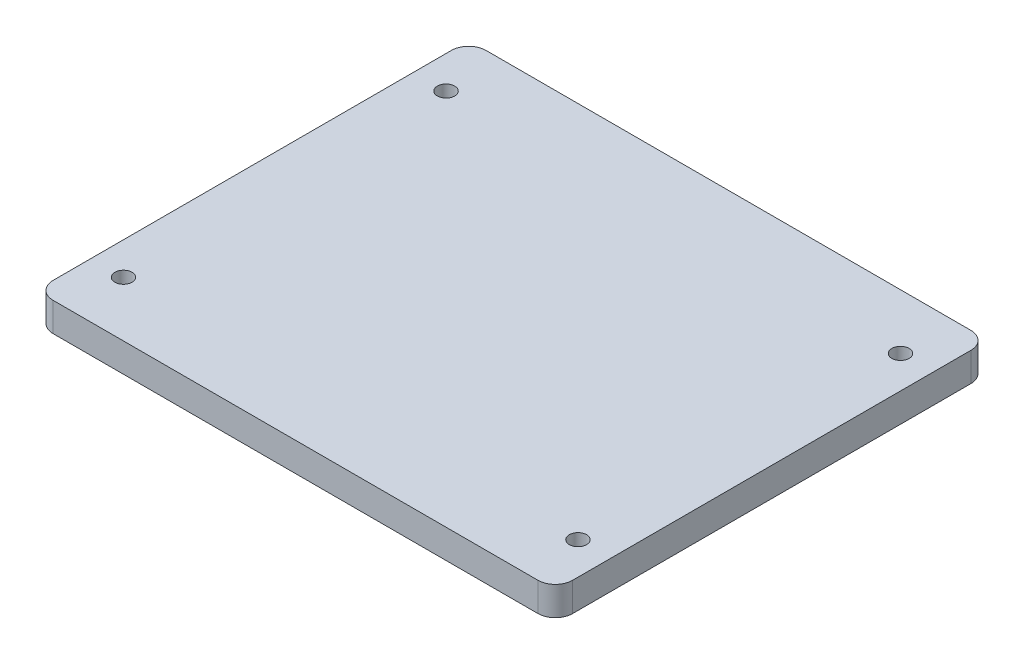
ISO-10303-21;
HEADER;
FILE_DESCRIPTION(('STEP AP214'),'2;1');
FILE_NAME('part.step','',(''),(''),'','','');
FILE_SCHEMA(('AUTOMOTIVE_DESIGN { 1 0 10303 214 1 1 1 1 }'));
ENDSEC;
DATA;
#1=APPLICATION_CONTEXT('core data for automotive mechanical design processes');
#2=APPLICATION_PROTOCOL_DEFINITION('international standard','automotive_design',2000,#1);
#3=PRODUCT_CONTEXT('',#1,'mechanical');
#4=PRODUCT('Part','Part','',(#3));
#5=PRODUCT_RELATED_PRODUCT_CATEGORY('part','',(#4));
#6=PRODUCT_DEFINITION_FORMATION('','',#4);
#7=PRODUCT_DEFINITION_CONTEXT('part definition',#1,'design');
#8=PRODUCT_DEFINITION('design','',#6,#7);
#9=PRODUCT_DEFINITION_SHAPE('','',#8);
#10=(LENGTH_UNIT() NAMED_UNIT(*) SI_UNIT(.MILLI.,.METRE.));
#11=(NAMED_UNIT(*) PLANE_ANGLE_UNIT() SI_UNIT($,.RADIAN.));
#12=(NAMED_UNIT(*) SI_UNIT($,.STERADIAN.) SOLID_ANGLE_UNIT());
#13=UNCERTAINTY_MEASURE_WITH_UNIT(LENGTH_MEASURE(1.E-05),#10,'distance_accuracy_value','');
#14=(GEOMETRIC_REPRESENTATION_CONTEXT(3) GLOBAL_UNCERTAINTY_ASSIGNED_CONTEXT((#13)) GLOBAL_UNIT_ASSIGNED_CONTEXT((#10,
#11,#12)) REPRESENTATION_CONTEXT('',''));
#15=CARTESIAN_POINT('',(0.,0.,0.));
#16=DIRECTION('',(0.,0.,1.));
#17=DIRECTION('',(1.,0.,0.));
#18=AXIS2_PLACEMENT_3D('',#15,#16,#17);
#19=CARTESIAN_POINT('',(0.,0.,0.));
#20=DIRECTION('',(0.,1.,0.));
#21=DIRECTION('',(0.,0.,1.));
#22=AXIS2_PLACEMENT_3D('',#19,#20,#21);
#23=PLANE('',#22);
#24=CARTESIAN_POINT('',(22.5,0.,32.5));
#25=DIRECTION('',(0.,-1.,0.));
#26=DIRECTION('',(0.,0.,-1.));
#27=AXIS2_PLACEMENT_3D('',#24,#25,#26);
#28=CIRCLE('',#27,4.50000000000001);
#29=CARTESIAN_POINT('',(22.5,0.,28.));
#30=VERTEX_POINT('',#29);
#31=EDGE_CURVE('E221',#30,#30,#28,.T.);
#32=ORIENTED_EDGE('',*,*,#31,.F.);
#33=EDGE_LOOP('',(#32));
#34=FACE_BOUND('',#33,.T.);
#35=CARTESIAN_POINT('',(-22.5,0.,32.5));
#36=DIRECTION('',(0.,-1.,0.));
#37=DIRECTION('',(0.,0.,-1.));
#38=AXIS2_PLACEMENT_3D('',#35,#36,#37);
#39=CIRCLE('',#38,4.50000000000001);
#40=CARTESIAN_POINT('',(-22.5,0.,28.));
#41=VERTEX_POINT('',#40);
#42=EDGE_CURVE('E227',#41,#41,#39,.F.);
#43=ORIENTED_EDGE('',*,*,#42,.T.);
#44=EDGE_LOOP('',(#43));
#45=FACE_BOUND('',#44,.T.);
#46=CARTESIAN_POINT('',(-22.5,0.,-32.5));
#47=DIRECTION('',(0.,-1.,0.));
#48=DIRECTION('',(0.,0.,-1.));
#49=AXIS2_PLACEMENT_3D('',#46,#47,#48);
#50=CIRCLE('',#49,4.5);
#51=CARTESIAN_POINT('',(-22.5,0.,-37.));
#52=VERTEX_POINT('',#51);
#53=EDGE_CURVE('E209',#52,#52,#50,.F.);
#54=ORIENTED_EDGE('',*,*,#53,.T.);
#55=EDGE_LOOP('',(#54));
#56=FACE_BOUND('',#55,.T.);
#57=CARTESIAN_POINT('',(-39.37,0.,27.94));
#58=DIRECTION('',(0.,1.,0.));
#59=DIRECTION('',(0.,0.,1.));
#60=AXIS2_PLACEMENT_3D('',#57,#58,#59);
#61=CIRCLE('',#60,1.5);
#62=CARTESIAN_POINT('',(-39.37,0.,29.44));
#63=VERTEX_POINT('',#62);
#64=EDGE_CURVE('E194',#63,#63,#61,.F.);
#65=ORIENTED_EDGE('',*,*,#64,.F.);
#66=EDGE_LOOP('',(#65));
#67=FACE_BOUND('',#66,.T.);
#68=CARTESIAN_POINT('',(39.37,0.,27.94));
#69=DIRECTION('',(0.,1.,0.));
#70=DIRECTION('',(0.,0.,1.));
#71=AXIS2_PLACEMENT_3D('',#68,#69,#70);
#72=CIRCLE('',#71,1.5);
#73=CARTESIAN_POINT('',(39.37,0.,29.44));
#74=VERTEX_POINT('',#73);
#75=EDGE_CURVE('E202',#74,#74,#72,.F.);
#76=ORIENTED_EDGE('',*,*,#75,.F.);
#77=EDGE_LOOP('',(#76));
#78=FACE_BOUND('',#77,.T.);
#79=CARTESIAN_POINT('',(39.37,0.,-27.94));
#80=DIRECTION('',(0.,1.,0.));
#81=DIRECTION('',(0.,0.,1.));
#82=AXIS2_PLACEMENT_3D('',#79,#80,#81);
#83=CIRCLE('',#82,1.5);
#84=CARTESIAN_POINT('',(39.37,0.,-26.44));
#85=VERTEX_POINT('',#84);
#86=EDGE_CURVE('E187',#85,#85,#83,.F.);
#87=ORIENTED_EDGE('',*,*,#86,.F.);
#88=EDGE_LOOP('',(#87));
#89=FACE_BOUND('',#88,.T.);
#90=CARTESIAN_POINT('',(-39.37,0.,-27.94));
#91=DIRECTION('',(0.,1.,0.));
#92=DIRECTION('',(0.,0.,1.));
#93=AXIS2_PLACEMENT_3D('',#90,#91,#92);
#94=CIRCLE('',#93,1.5);
#95=CARTESIAN_POINT('',(-39.37,0.,-26.44));
#96=VERTEX_POINT('',#95);
#97=EDGE_CURVE('E178',#96,#96,#94,.F.);
#98=ORIENTED_EDGE('',*,*,#97,.F.);
#99=EDGE_LOOP('',(#98));
#100=FACE_BOUND('',#99,.T.);
#101=DIRECTION('',(0.,0.,1.));
#102=VECTOR('',#101,1.);
#103=CARTESIAN_POINT('',(-45.,0.,-37.5));
#104=LINE('',#103,#102);
#105=CARTESIAN_POINT('',(-45.,0.,-34.5));
#106=VERTEX_POINT('',#105);
#107=CARTESIAN_POINT('',(-45.,0.,34.5));
#108=VERTEX_POINT('',#107);
#109=EDGE_CURVE('E120',#106,#108,#104,.T.);
#110=ORIENTED_EDGE('',*,*,#109,.F.);
#111=CARTESIAN_POINT('',(-42.,0.,-34.5));
#112=DIRECTION('',(0.,1.,0.));
#113=DIRECTION('',(0.,0.,1.));
#114=AXIS2_PLACEMENT_3D('',#111,#112,#113);
#115=CIRCLE('',#114,3.);
#116=CARTESIAN_POINT('',(-42.,0.,-37.5));
#117=VERTEX_POINT('',#116);
#118=EDGE_CURVE('E103',#106,#117,#115,.F.);
#119=ORIENTED_EDGE('',*,*,#118,.T.);
#120=DIRECTION('',(-1.,0.,0.));
#121=VECTOR('',#120,1.);
#122=CARTESIAN_POINT('',(-45.,0.,-37.5));
#123=LINE('',#122,#121);
#124=CARTESIAN_POINT('',(42.,0.,-37.5));
#125=VERTEX_POINT('',#124);
#126=EDGE_CURVE('E129',#125,#117,#123,.T.);
#127=ORIENTED_EDGE('',*,*,#126,.F.);
#128=CARTESIAN_POINT('',(42.,0.,-34.5));
#129=DIRECTION('',(0.,1.,0.));
#130=DIRECTION('',(0.,0.,1.));
#131=AXIS2_PLACEMENT_3D('',#128,#129,#130);
#132=CIRCLE('',#131,3.);
#133=CARTESIAN_POINT('',(45.,0.,-34.5));
#134=VERTEX_POINT('',#133);
#135=EDGE_CURVE('E114',#125,#134,#132,.F.);
#136=ORIENTED_EDGE('',*,*,#135,.T.);
#137=DIRECTION('',(0.,0.,-1.));
#138=VECTOR('',#137,1.);
#139=CARTESIAN_POINT('',(45.,0.,-37.5));
#140=LINE('',#139,#138);
#141=CARTESIAN_POINT('',(45.,0.,34.5));
#142=VERTEX_POINT('',#141);
#143=EDGE_CURVE('E133',#142,#134,#140,.T.);
#144=ORIENTED_EDGE('',*,*,#143,.F.);
#145=CARTESIAN_POINT('',(42.,0.,34.5));
#146=DIRECTION('',(0.,1.,0.));
#147=DIRECTION('',(0.,0.,1.));
#148=AXIS2_PLACEMENT_3D('',#145,#146,#147);
#149=CIRCLE('',#148,3.);
#150=CARTESIAN_POINT('',(42.,0.,37.5));
#151=VERTEX_POINT('',#150);
#152=EDGE_CURVE('E140',#142,#151,#149,.F.);
#153=ORIENTED_EDGE('',*,*,#152,.T.);
#154=DIRECTION('',(1.,0.,0.));
#155=VECTOR('',#154,1.);
#156=CARTESIAN_POINT('',(-45.,0.,37.5));
#157=LINE('',#156,#155);
#158=CARTESIAN_POINT('',(-42.,0.,37.5));
#159=VERTEX_POINT('',#158);
#160=EDGE_CURVE('E128',#159,#151,#157,.T.);
#161=ORIENTED_EDGE('',*,*,#160,.F.);
#162=CARTESIAN_POINT('',(-42.,0.,34.5));
#163=DIRECTION('',(0.,1.,0.));
#164=DIRECTION('',(0.,0.,1.));
#165=AXIS2_PLACEMENT_3D('',#162,#163,#164);
#166=CIRCLE('',#165,3.);
#167=EDGE_CURVE('E123',#159,#108,#166,.F.);
#168=ORIENTED_EDGE('',*,*,#167,.T.);
#169=EDGE_LOOP('',(#110,#119,#127,#136,#144,#153,#161,#168));
#170=FACE_BOUND('',#169,.T.);
#171=CARTESIAN_POINT('',(22.5,0.,-32.5));
#172=DIRECTION('',(0.,-1.,0.));
#173=DIRECTION('',(0.,0.,-1.));
#174=AXIS2_PLACEMENT_3D('',#171,#172,#173);
#175=CIRCLE('',#174,4.5);
#176=CARTESIAN_POINT('',(22.5,0.,-37.));
#177=VERTEX_POINT('',#176);
#178=EDGE_CURVE('E215',#177,#177,#175,.T.);
#179=ORIENTED_EDGE('',*,*,#178,.F.);
#180=EDGE_LOOP('',(#179));
#181=FACE_BOUND('',#180,.T.);
#182=ADVANCED_FACE('F38',(#34,#45,#56,#67,#78,#89,#100,#170,#181),#23,.F.);
#183=CARTESIAN_POINT('',(45.,5.,-37.5));
#184=DIRECTION('',(-1.,0.,0.));
#185=DIRECTION('',(0.,0.,1.));
#186=AXIS2_PLACEMENT_3D('',#183,#184,#185);
#187=PLANE('',#186);
#188=ORIENTED_EDGE('',*,*,#143,.T.);
#189=DIRECTION('',(0.,-1.,0.));
#190=VECTOR('',#189,1.);
#191=CARTESIAN_POINT('',(45.,5.,-34.5));
#192=LINE('',#191,#190);
#193=CARTESIAN_POINT('',(45.,5.,-34.5));
#194=VERTEX_POINT('',#193);
#195=EDGE_CURVE('E156',#134,#194,#192,.F.);
#196=ORIENTED_EDGE('',*,*,#195,.T.);
#197=DIRECTION('',(0.,0.,-1.));
#198=VECTOR('',#197,1.);
#199=CARTESIAN_POINT('',(45.,5.,-37.5));
#200=LINE('',#199,#198);
#201=CARTESIAN_POINT('',(45.,5.,34.5));
#202=VERTEX_POINT('',#201);
#203=EDGE_CURVE('E131',#202,#194,#200,.T.);
#204=ORIENTED_EDGE('',*,*,#203,.F.);
#205=DIRECTION('',(0.,-1.,0.));
#206=VECTOR('',#205,1.);
#207=CARTESIAN_POINT('',(45.,5.,34.5));
#208=LINE('',#207,#206);
#209=EDGE_CURVE('E153',#202,#142,#208,.T.);
#210=ORIENTED_EDGE('',*,*,#209,.T.);
#211=EDGE_LOOP('',(#188,#196,#204,#210));
#212=FACE_BOUND('',#211,.T.);
#213=ADVANCED_FACE('F169',(#212),#187,.F.);
#214=CARTESIAN_POINT('',(-45.,5.,-37.5));
#215=DIRECTION('',(0.,0.,1.));
#216=DIRECTION('',(1.,0.,0.));
#217=AXIS2_PLACEMENT_3D('',#214,#215,#216);
#218=PLANE('',#217);
#219=ORIENTED_EDGE('',*,*,#126,.T.);
#220=DIRECTION('',(0.,-1.,0.));
#221=VECTOR('',#220,1.);
#222=CARTESIAN_POINT('',(-42.,5.,-37.5));
#223=LINE('',#222,#221);
#224=CARTESIAN_POINT('',(-42.,5.,-37.5));
#225=VERTEX_POINT('',#224);
#226=EDGE_CURVE('E108',#117,#225,#223,.F.);
#227=ORIENTED_EDGE('',*,*,#226,.T.);
#228=DIRECTION('',(-1.,0.,0.));
#229=VECTOR('',#228,1.);
#230=CARTESIAN_POINT('',(-45.,5.,-37.5));
#231=LINE('',#230,#229);
#232=CARTESIAN_POINT('',(42.,5.,-37.5));
#233=VERTEX_POINT('',#232);
#234=EDGE_CURVE('E173',#233,#225,#231,.T.);
#235=ORIENTED_EDGE('',*,*,#234,.F.);
#236=DIRECTION('',(0.,-1.,0.));
#237=VECTOR('',#236,1.);
#238=CARTESIAN_POINT('',(42.,5.,-37.5));
#239=LINE('',#238,#237);
#240=EDGE_CURVE('E113',#233,#125,#239,.T.);
#241=ORIENTED_EDGE('',*,*,#240,.T.);
#242=EDGE_LOOP('',(#219,#227,#235,#241));
#243=FACE_BOUND('',#242,.T.);
#244=ADVANCED_FACE('F255',(#243),#218,.F.);
#245=CARTESIAN_POINT('',(-45.,5.,-37.5));
#246=DIRECTION('',(1.,0.,0.));
#247=DIRECTION('',(0.,0.,-1.));
#248=AXIS2_PLACEMENT_3D('',#245,#246,#247);
#249=PLANE('',#248);
#250=DIRECTION('',(0.,0.,1.));
#251=VECTOR('',#250,1.);
#252=CARTESIAN_POINT('',(-45.,5.,-37.5));
#253=LINE('',#252,#251);
#254=CARTESIAN_POINT('',(-45.,5.,-34.5));
#255=VERTEX_POINT('',#254);
#256=CARTESIAN_POINT('',(-45.,5.,34.5));
#257=VERTEX_POINT('',#256);
#258=EDGE_CURVE('E122',#255,#257,#253,.T.);
#259=ORIENTED_EDGE('',*,*,#258,.F.);
#260=DIRECTION('',(0.,-1.,0.));
#261=VECTOR('',#260,1.);
#262=CARTESIAN_POINT('',(-45.,5.,-34.5));
#263=LINE('',#262,#261);
#264=EDGE_CURVE('E107',#255,#106,#263,.T.);
#265=ORIENTED_EDGE('',*,*,#264,.T.);
#266=ORIENTED_EDGE('',*,*,#109,.T.);
#267=DIRECTION('',(0.,-1.,0.));
#268=VECTOR('',#267,1.);
#269=CARTESIAN_POINT('',(-45.,5.,34.5));
#270=LINE('',#269,#268);
#271=EDGE_CURVE('E124',#108,#257,#270,.F.);
#272=ORIENTED_EDGE('',*,*,#271,.T.);
#273=EDGE_LOOP('',(#259,#265,#266,#272));
#274=FACE_BOUND('',#273,.T.);
#275=ADVANCED_FACE('F119',(#274),#249,.F.);
#276=CARTESIAN_POINT('',(-45.,5.,37.5));
#277=DIRECTION('',(0.,0.,-1.));
#278=DIRECTION('',(-1.,0.,0.));
#279=AXIS2_PLACEMENT_3D('',#276,#277,#278);
#280=PLANE('',#279);
#281=ORIENTED_EDGE('',*,*,#160,.T.);
#282=DIRECTION('',(0.,-1.,0.));
#283=VECTOR('',#282,1.);
#284=CARTESIAN_POINT('',(42.,5.,37.5));
#285=LINE('',#284,#283);
#286=CARTESIAN_POINT('',(42.,5.,37.5));
#287=VERTEX_POINT('',#286);
#288=EDGE_CURVE('E11',#151,#287,#285,.F.);
#289=ORIENTED_EDGE('',*,*,#288,.T.);
#290=DIRECTION('',(1.,0.,0.));
#291=VECTOR('',#290,1.);
#292=CARTESIAN_POINT('',(-45.,5.,37.5));
#293=LINE('',#292,#291);
#294=CARTESIAN_POINT('',(-42.,5.,37.5));
#295=VERTEX_POINT('',#294);
#296=EDGE_CURVE('E137',#295,#287,#293,.T.);
#297=ORIENTED_EDGE('',*,*,#296,.F.);
#298=DIRECTION('',(0.,-1.,0.));
#299=VECTOR('',#298,1.);
#300=CARTESIAN_POINT('',(-42.,5.,37.5));
#301=LINE('',#300,#299);
#302=EDGE_CURVE('E46',#295,#159,#301,.T.);
#303=ORIENTED_EDGE('',*,*,#302,.T.);
#304=EDGE_LOOP('',(#281,#289,#297,#303));
#305=FACE_BOUND('',#304,.T.);
#306=ADVANCED_FACE('F159',(#305),#280,.F.);
#307=CARTESIAN_POINT('',(0.,5.,0.));
#308=DIRECTION('',(0.,1.,0.));
#309=DIRECTION('',(0.,0.,1.));
#310=AXIS2_PLACEMENT_3D('',#307,#308,#309);
#311=PLANE('',#310);
#312=CARTESIAN_POINT('',(-39.37,5.,27.94));
#313=DIRECTION('',(0.,1.,0.));
#314=DIRECTION('',(0.,0.,1.));
#315=AXIS2_PLACEMENT_3D('',#312,#313,#314);
#316=CIRCLE('',#315,1.5);
#317=CARTESIAN_POINT('',(-39.37,5.,29.44));
#318=VERTEX_POINT('',#317);
#319=EDGE_CURVE('E198',#318,#318,#316,.T.);
#320=ORIENTED_EDGE('',*,*,#319,.F.);
#321=EDGE_LOOP('',(#320));
#322=FACE_BOUND('',#321,.T.);
#323=CARTESIAN_POINT('',(39.37,5.,27.94));
#324=DIRECTION('',(0.,1.,0.));
#325=DIRECTION('',(0.,0.,1.));
#326=AXIS2_PLACEMENT_3D('',#323,#324,#325);
#327=CIRCLE('',#326,1.5);
#328=CARTESIAN_POINT('',(39.37,5.,29.44));
#329=VERTEX_POINT('',#328);
#330=EDGE_CURVE('E197',#329,#329,#327,.T.);
#331=ORIENTED_EDGE('',*,*,#330,.F.);
#332=EDGE_LOOP('',(#331));
#333=FACE_BOUND('',#332,.T.);
#334=CARTESIAN_POINT('',(39.37,5.,-27.94));
#335=DIRECTION('',(0.,1.,0.));
#336=DIRECTION('',(0.,0.,1.));
#337=AXIS2_PLACEMENT_3D('',#334,#335,#336);
#338=CIRCLE('',#337,1.5);
#339=CARTESIAN_POINT('',(39.37,5.,-26.44));
#340=VERTEX_POINT('',#339);
#341=EDGE_CURVE('E191',#340,#340,#338,.T.);
#342=ORIENTED_EDGE('',*,*,#341,.F.);
#343=EDGE_LOOP('',(#342));
#344=FACE_BOUND('',#343,.T.);
#345=CARTESIAN_POINT('',(-39.37,5.,-27.94));
#346=DIRECTION('',(0.,1.,0.));
#347=DIRECTION('',(0.,0.,1.));
#348=AXIS2_PLACEMENT_3D('',#345,#346,#347);
#349=CIRCLE('',#348,1.5);
#350=CARTESIAN_POINT('',(-39.37,5.,-26.44));
#351=VERTEX_POINT('',#350);
#352=EDGE_CURVE('E183',#351,#351,#349,.T.);
#353=ORIENTED_EDGE('',*,*,#352,.F.);
#354=EDGE_LOOP('',(#353));
#355=FACE_BOUND('',#354,.T.);
#356=ORIENTED_EDGE('',*,*,#234,.T.);
#357=CARTESIAN_POINT('',(-42.,5.,-34.5));
#358=DIRECTION('',(0.,1.,0.));
#359=DIRECTION('',(0.,0.,1.));
#360=AXIS2_PLACEMENT_3D('',#357,#358,#359);
#361=CIRCLE('',#360,3.);
#362=EDGE_CURVE('E151',#225,#255,#361,.T.);
#363=ORIENTED_EDGE('',*,*,#362,.T.);
#364=ORIENTED_EDGE('',*,*,#258,.T.);
#365=CARTESIAN_POINT('',(-42.,5.,34.5));
#366=DIRECTION('',(0.,1.,0.));
#367=DIRECTION('',(0.,0.,1.));
#368=AXIS2_PLACEMENT_3D('',#365,#366,#367);
#369=CIRCLE('',#368,3.);
#370=EDGE_CURVE('E58',#257,#295,#369,.T.);
#371=ORIENTED_EDGE('',*,*,#370,.T.);
#372=ORIENTED_EDGE('',*,*,#296,.T.);
#373=CARTESIAN_POINT('',(42.,5.,34.5));
#374=DIRECTION('',(0.,1.,0.));
#375=DIRECTION('',(0.,0.,1.));
#376=AXIS2_PLACEMENT_3D('',#373,#374,#375);
#377=CIRCLE('',#376,3.);
#378=EDGE_CURVE('E147',#287,#202,#377,.T.);
#379=ORIENTED_EDGE('',*,*,#378,.T.);
#380=ORIENTED_EDGE('',*,*,#203,.T.);
#381=CARTESIAN_POINT('',(42.,5.,-34.5));
#382=DIRECTION('',(0.,1.,0.));
#383=DIRECTION('',(0.,0.,1.));
#384=AXIS2_PLACEMENT_3D('',#381,#382,#383);
#385=CIRCLE('',#384,3.);
#386=EDGE_CURVE('E149',#194,#233,#385,.T.);
#387=ORIENTED_EDGE('',*,*,#386,.T.);
#388=EDGE_LOOP('',(#356,#363,#364,#371,#372,#379,#380,#387));
#389=FACE_BOUND('',#388,.T.);
#390=ADVANCED_FACE('F261',(#322,#333,#344,#355,#389),#311,.T.);
#391=CARTESIAN_POINT('',(-39.37,-4.24264068711929,-27.94));
#392=DIRECTION('',(0.,1.,0.));
#393=DIRECTION('',(0.,0.,1.));
#394=AXIS2_PLACEMENT_3D('',#391,#392,#393);
#395=CYLINDRICAL_SURFACE('',#394,1.5);
#396=ORIENTED_EDGE('',*,*,#97,.T.);
#397=EDGE_LOOP('',(#396));
#398=FACE_BOUND('',#397,.T.);
#399=ORIENTED_EDGE('',*,*,#352,.T.);
#400=EDGE_LOOP('',(#399));
#401=FACE_BOUND('',#400,.T.);
#402=ADVANCED_FACE('F285',(#398,#401),#395,.F.);
#403=CARTESIAN_POINT('',(39.37,-4.24264068711929,-27.94));
#404=DIRECTION('',(0.,1.,0.));
#405=DIRECTION('',(0.,0.,1.));
#406=AXIS2_PLACEMENT_3D('',#403,#404,#405);
#407=CYLINDRICAL_SURFACE('',#406,1.5);
#408=ORIENTED_EDGE('',*,*,#86,.T.);
#409=EDGE_LOOP('',(#408));
#410=FACE_BOUND('',#409,.T.);
#411=ORIENTED_EDGE('',*,*,#341,.T.);
#412=EDGE_LOOP('',(#411));
#413=FACE_BOUND('',#412,.T.);
#414=ADVANCED_FACE('F290',(#410,#413),#407,.F.);
#415=CARTESIAN_POINT('',(39.37,-4.24264068711929,27.94));
#416=DIRECTION('',(0.,1.,0.));
#417=DIRECTION('',(0.,0.,1.));
#418=AXIS2_PLACEMENT_3D('',#415,#416,#417);
#419=CYLINDRICAL_SURFACE('',#418,1.5);
#420=ORIENTED_EDGE('',*,*,#75,.T.);
#421=EDGE_LOOP('',(#420));
#422=FACE_BOUND('',#421,.T.);
#423=ORIENTED_EDGE('',*,*,#330,.T.);
#424=EDGE_LOOP('',(#423));
#425=FACE_BOUND('',#424,.T.);
#426=ADVANCED_FACE('F299',(#422,#425),#419,.F.);
#427=CARTESIAN_POINT('',(-39.37,-4.24264068711929,27.94));
#428=DIRECTION('',(0.,1.,0.));
#429=DIRECTION('',(0.,0.,1.));
#430=AXIS2_PLACEMENT_3D('',#427,#428,#429);
#431=CYLINDRICAL_SURFACE('',#430,1.5);
#432=ORIENTED_EDGE('',*,*,#64,.T.);
#433=EDGE_LOOP('',(#432));
#434=FACE_BOUND('',#433,.T.);
#435=ORIENTED_EDGE('',*,*,#319,.T.);
#436=EDGE_LOOP('',(#435));
#437=FACE_BOUND('',#436,.T.);
#438=ADVANCED_FACE('F305',(#434,#437),#431,.F.);
#439=CARTESIAN_POINT('',(-22.5,2.,-32.5));
#440=DIRECTION('',(0.,-1.,0.));
#441=DIRECTION('',(0.,0.,-1.));
#442=AXIS2_PLACEMENT_3D('',#439,#440,#441);
#443=CYLINDRICAL_SURFACE('',#442,4.5);
#444=CARTESIAN_POINT('',(-22.5,2.,-32.5));
#445=DIRECTION('',(0.,-1.,0.));
#446=DIRECTION('',(0.,0.,-1.));
#447=AXIS2_PLACEMENT_3D('',#444,#445,#446);
#448=CIRCLE('',#447,4.5);
#449=CARTESIAN_POINT('',(-22.5,2.,-37.));
#450=VERTEX_POINT('',#449);
#451=EDGE_CURVE('E201',#450,#450,#448,.F.);
#452=ORIENTED_EDGE('',*,*,#451,.T.);
#453=EDGE_LOOP('',(#452));
#454=FACE_BOUND('',#453,.T.);
#455=ORIENTED_EDGE('',*,*,#53,.F.);
#456=EDGE_LOOP('',(#455));
#457=FACE_BOUND('',#456,.T.);
#458=ADVANCED_FACE('F309',(#454,#457),#443,.F.);
#459=CARTESIAN_POINT('',(0.,2.,0.));
#460=DIRECTION('',(0.,-1.,0.));
#461=DIRECTION('',(0.,0.,-1.));
#462=AXIS2_PLACEMENT_3D('',#459,#460,#461);
#463=PLANE('',#462);
#464=ORIENTED_EDGE('',*,*,#451,.F.);
#465=EDGE_LOOP('',(#464));
#466=FACE_BOUND('',#465,.T.);
#467=ADVANCED_FACE('F247',(#466),#463,.T.);
#468=CARTESIAN_POINT('',(-22.5,2.,32.5));
#469=DIRECTION('',(0.,-1.,0.));
#470=DIRECTION('',(0.,0.,-1.));
#471=AXIS2_PLACEMENT_3D('',#468,#469,#470);
#472=CYLINDRICAL_SURFACE('',#471,4.50000000000001);
#473=CARTESIAN_POINT('',(-22.5,2.,32.5));
#474=DIRECTION('',(0.,-1.,0.));
#475=DIRECTION('',(0.,0.,-1.));
#476=AXIS2_PLACEMENT_3D('',#473,#474,#475);
#477=CIRCLE('',#476,4.50000000000001);
#478=CARTESIAN_POINT('',(-22.5,2.,28.));
#479=VERTEX_POINT('',#478);
#480=EDGE_CURVE('E212',#479,#479,#477,.F.);
#481=ORIENTED_EDGE('',*,*,#480,.T.);
#482=EDGE_LOOP('',(#481));
#483=FACE_BOUND('',#482,.T.);
#484=ORIENTED_EDGE('',*,*,#42,.F.);
#485=EDGE_LOOP('',(#484));
#486=FACE_BOUND('',#485,.T.);
#487=ADVANCED_FACE('F233',(#483,#486),#472,.F.);
#488=CARTESIAN_POINT('',(0.,2.,0.));
#489=DIRECTION('',(0.,-1.,0.));
#490=DIRECTION('',(0.,0.,-1.));
#491=AXIS2_PLACEMENT_3D('',#488,#489,#490);
#492=PLANE('',#491);
#493=ORIENTED_EDGE('',*,*,#480,.F.);
#494=EDGE_LOOP('',(#493));
#495=FACE_BOUND('',#494,.T.);
#496=ADVANCED_FACE('F236',(#495),#492,.T.);
#497=CARTESIAN_POINT('',(22.5,2.,32.5));
#498=DIRECTION('',(0.,-1.,0.));
#499=DIRECTION('',(0.,0.,-1.));
#500=AXIS2_PLACEMENT_3D('',#497,#498,#499);
#501=CYLINDRICAL_SURFACE('',#500,4.50000000000001);
#502=CARTESIAN_POINT('',(22.5,2.,32.5));
#503=DIRECTION('',(0.,-1.,0.));
#504=DIRECTION('',(0.,0.,-1.));
#505=AXIS2_PLACEMENT_3D('',#502,#503,#504);
#506=CIRCLE('',#505,4.50000000000001);
#507=CARTESIAN_POINT('',(22.5,2.,28.));
#508=VERTEX_POINT('',#507);
#509=EDGE_CURVE('E224',#508,#508,#506,.T.);
#510=ORIENTED_EDGE('',*,*,#509,.F.);
#511=EDGE_LOOP('',(#510));
#512=FACE_BOUND('',#511,.T.);
#513=ORIENTED_EDGE('',*,*,#31,.T.);
#514=EDGE_LOOP('',(#513));
#515=FACE_BOUND('',#514,.T.);
#516=ADVANCED_FACE('F238',(#512,#515),#501,.F.);
#517=CARTESIAN_POINT('',(0.,2.,0.));
#518=DIRECTION('',(0.,-1.,0.));
#519=DIRECTION('',(0.,0.,-1.));
#520=AXIS2_PLACEMENT_3D('',#517,#518,#519);
#521=PLANE('',#520);
#522=ORIENTED_EDGE('',*,*,#509,.T.);
#523=EDGE_LOOP('',(#522));
#524=FACE_BOUND('',#523,.T.);
#525=ADVANCED_FACE('F244',(#524),#521,.T.);
#526=CARTESIAN_POINT('',(22.5,2.,-32.5));
#527=DIRECTION('',(0.,-1.,0.));
#528=DIRECTION('',(0.,0.,-1.));
#529=AXIS2_PLACEMENT_3D('',#526,#527,#528);
#530=CYLINDRICAL_SURFACE('',#529,4.5);
#531=CARTESIAN_POINT('',(22.5,2.,-32.5));
#532=DIRECTION('',(0.,-1.,0.));
#533=DIRECTION('',(0.,0.,-1.));
#534=AXIS2_PLACEMENT_3D('',#531,#532,#533);
#535=CIRCLE('',#534,4.5);
#536=CARTESIAN_POINT('',(22.5,2.,-37.));
#537=VERTEX_POINT('',#536);
#538=EDGE_CURVE('E218',#537,#537,#535,.T.);
#539=ORIENTED_EDGE('',*,*,#538,.F.);
#540=EDGE_LOOP('',(#539));
#541=FACE_BOUND('',#540,.T.);
#542=ORIENTED_EDGE('',*,*,#178,.T.);
#543=EDGE_LOOP('',(#542));
#544=FACE_BOUND('',#543,.T.);
#545=ADVANCED_FACE('F338',(#541,#544),#530,.F.);
#546=CARTESIAN_POINT('',(0.,2.,0.));
#547=DIRECTION('',(0.,-1.,0.));
#548=DIRECTION('',(0.,0.,-1.));
#549=AXIS2_PLACEMENT_3D('',#546,#547,#548);
#550=PLANE('',#549);
#551=ORIENTED_EDGE('',*,*,#538,.T.);
#552=EDGE_LOOP('',(#551));
#553=FACE_BOUND('',#552,.T.);
#554=ADVANCED_FACE('F273',(#553),#550,.T.);
#555=CARTESIAN_POINT('',(-42.,5.,-34.5));
#556=DIRECTION('',(0.,-1.,0.));
#557=DIRECTION('',(0.,0.,-1.));
#558=AXIS2_PLACEMENT_3D('',#555,#556,#557);
#559=CYLINDRICAL_SURFACE('',#558,3.);
#560=ORIENTED_EDGE('',*,*,#362,.F.);
#561=ORIENTED_EDGE('',*,*,#226,.F.);
#562=ORIENTED_EDGE('',*,*,#118,.F.);
#563=ORIENTED_EDGE('',*,*,#264,.F.);
#564=EDGE_LOOP('',(#560,#561,#562,#563));
#565=FACE_BOUND('',#564,.T.);
#566=ADVANCED_FACE('F106',(#565),#559,.T.);
#567=CARTESIAN_POINT('',(42.,5.,-34.5));
#568=DIRECTION('',(0.,-1.,0.));
#569=DIRECTION('',(0.,0.,-1.));
#570=AXIS2_PLACEMENT_3D('',#567,#568,#569);
#571=CYLINDRICAL_SURFACE('',#570,3.);
#572=ORIENTED_EDGE('',*,*,#386,.F.);
#573=ORIENTED_EDGE('',*,*,#195,.F.);
#574=ORIENTED_EDGE('',*,*,#135,.F.);
#575=ORIENTED_EDGE('',*,*,#240,.F.);
#576=EDGE_LOOP('',(#572,#573,#574,#575));
#577=FACE_BOUND('',#576,.T.);
#578=ADVANCED_FACE('F272',(#577),#571,.T.);
#579=CARTESIAN_POINT('',(42.,5.,34.5));
#580=DIRECTION('',(0.,-1.,0.));
#581=DIRECTION('',(0.,0.,-1.));
#582=AXIS2_PLACEMENT_3D('',#579,#580,#581);
#583=CYLINDRICAL_SURFACE('',#582,3.);
#584=ORIENTED_EDGE('',*,*,#378,.F.);
#585=ORIENTED_EDGE('',*,*,#288,.F.);
#586=ORIENTED_EDGE('',*,*,#152,.F.);
#587=ORIENTED_EDGE('',*,*,#209,.F.);
#588=EDGE_LOOP('',(#584,#585,#586,#587));
#589=FACE_BOUND('',#588,.T.);
#590=ADVANCED_FACE('F166',(#589),#583,.T.);
#591=CARTESIAN_POINT('',(-42.,5.,34.5));
#592=DIRECTION('',(0.,-1.,0.));
#593=DIRECTION('',(0.,0.,-1.));
#594=AXIS2_PLACEMENT_3D('',#591,#592,#593);
#595=CYLINDRICAL_SURFACE('',#594,3.);
#596=ORIENTED_EDGE('',*,*,#370,.F.);
#597=ORIENTED_EDGE('',*,*,#271,.F.);
#598=ORIENTED_EDGE('',*,*,#167,.F.);
#599=ORIENTED_EDGE('',*,*,#302,.F.);
#600=EDGE_LOOP('',(#596,#597,#598,#599));
#601=FACE_BOUND('',#600,.T.);
#602=ADVANCED_FACE('F40',(#601),#595,.T.);
#603=CLOSED_SHELL('',(#182,#213,#244,#275,#306,#390,#402,#414,#426,#438,#458,#467,#487,#496,
#516,#525,#545,#554,#566,#578,#590,#602));
#604=MANIFOLD_SOLID_BREP('B2',#603);
#605=ADVANCED_BREP_SHAPE_REPRESENTATION('',(#18,#604),#14);
#606=SHAPE_DEFINITION_REPRESENTATION(#9,#605);
ENDSEC;
END-ISO-10303-21;
